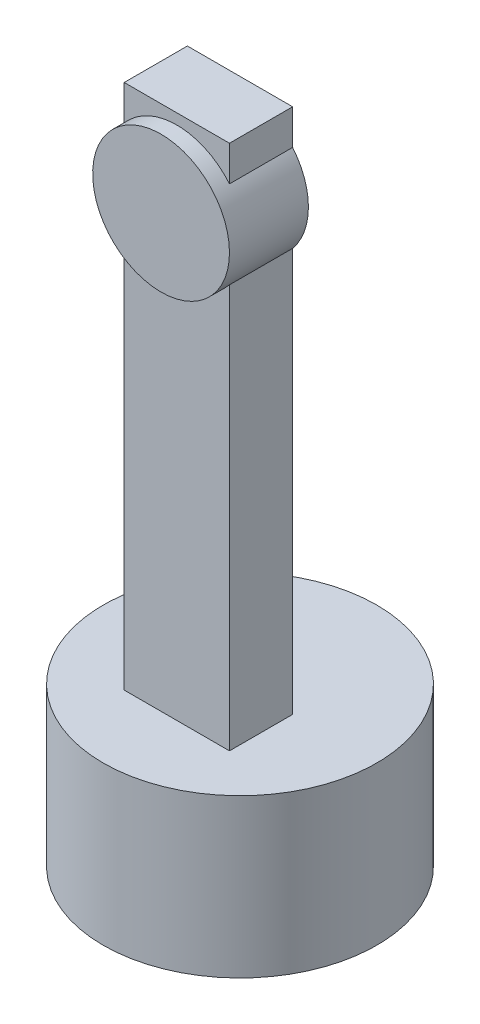
ISO-10303-21;
HEADER;
FILE_DESCRIPTION(('STEP AP214'),'2;1');
FILE_NAME('part.step','',(''),(''),'','','');
FILE_SCHEMA(('AUTOMOTIVE_DESIGN { 1 0 10303 214 1 1 1 1 }'));
ENDSEC;
DATA;
#1=APPLICATION_CONTEXT('core data for automotive mechanical design processes');
#2=APPLICATION_PROTOCOL_DEFINITION('international standard','automotive_design',2000,#1);
#3=PRODUCT_CONTEXT('',#1,'mechanical');
#4=PRODUCT('Part','Part','',(#3));
#5=PRODUCT_RELATED_PRODUCT_CATEGORY('part','',(#4));
#6=PRODUCT_DEFINITION_FORMATION('','',#4);
#7=PRODUCT_DEFINITION_CONTEXT('part definition',#1,'design');
#8=PRODUCT_DEFINITION('design','',#6,#7);
#9=PRODUCT_DEFINITION_SHAPE('','',#8);
#10=(LENGTH_UNIT() NAMED_UNIT(*) SI_UNIT(.MILLI.,.METRE.));
#11=(NAMED_UNIT(*) PLANE_ANGLE_UNIT() SI_UNIT($,.RADIAN.));
#12=(NAMED_UNIT(*) SI_UNIT($,.STERADIAN.) SOLID_ANGLE_UNIT());
#13=UNCERTAINTY_MEASURE_WITH_UNIT(LENGTH_MEASURE(1.E-05),#10,'distance_accuracy_value','');
#14=(GEOMETRIC_REPRESENTATION_CONTEXT(3) GLOBAL_UNCERTAINTY_ASSIGNED_CONTEXT((#13)) GLOBAL_UNIT_ASSIGNED_CONTEXT((#10,
#11,#12)) REPRESENTATION_CONTEXT('',''));
#15=CARTESIAN_POINT('',(0.,0.,0.));
#16=DIRECTION('',(0.,0.,1.));
#17=DIRECTION('',(1.,0.,0.));
#18=AXIS2_PLACEMENT_3D('',#15,#16,#17);
#19=CARTESIAN_POINT('',(-10000.,26000.,12000.));
#20=DIRECTION('',(1.,0.,0.));
#21=DIRECTION('',(0.,0.,-1.));
#22=AXIS2_PLACEMENT_3D('',#19,#20,#21);
#23=PLANE('',#22);
#24=DIRECTION('',(0.,0.,-1.));
#25=VECTOR('',#24,1.);
#26=CARTESIAN_POINT('',(-10000.,106693.376137082,15000.));
#27=LINE('',#26,#25);
#28=CARTESIAN_POINT('',(-10000.,106693.376137082,0.));
#29=VERTEX_POINT('',#28);
#30=CARTESIAN_POINT('',(-10000.,106693.376137082,12000.));
#31=VERTEX_POINT('',#30);
#32=EDGE_CURVE('E151',#29,#31,#27,.F.);
#33=ORIENTED_EDGE('',*,*,#32,.F.);
#34=DIRECTION('',(0.,-1.,0.));
#35=VECTOR('',#34,1.);
#36=CARTESIAN_POINT('',(-10000.,26000.,0.));
#37=LINE('',#36,#35);
#38=CARTESIAN_POINT('',(-10000.,30000.,0.));
#39=VERTEX_POINT('',#38);
#40=EDGE_CURVE('E154',#29,#39,#37,.T.);
#41=ORIENTED_EDGE('',*,*,#40,.T.);
#42=DIRECTION('',(0.,0.,-1.));
#43=VECTOR('',#42,1.);
#44=CARTESIAN_POINT('',(-10000.,30000.,0.));
#45=LINE('',#44,#43);
#46=CARTESIAN_POINT('',(-10000.,30000.,12000.));
#47=VERTEX_POINT('',#46);
#48=EDGE_CURVE('E53',#47,#39,#45,.T.);
#49=ORIENTED_EDGE('',*,*,#48,.F.);
#50=DIRECTION('',(0.,-1.,0.));
#51=VECTOR('',#50,1.);
#52=CARTESIAN_POINT('',(-10000.,26000.,12000.));
#53=LINE('',#52,#51);
#54=EDGE_CURVE('E116',#31,#47,#53,.T.);
#55=ORIENTED_EDGE('',*,*,#54,.F.);
#56=EDGE_LOOP('',(#33,#41,#49,#55));
#57=FACE_BOUND('',#56,.T.);
#58=ADVANCED_FACE('F44',(#57),#23,.F.);
#59=DIRECTION('',(0.,0.,-1.));
#60=VECTOR('',#59,1.);
#61=CARTESIAN_POINT('',(-10000.,123306.623862918,15000.));
#62=LINE('',#61,#60);
#63=CARTESIAN_POINT('',(-10000.,123306.623862918,12000.));
#64=VERTEX_POINT('',#63);
#65=CARTESIAN_POINT('',(-10000.,123306.623862918,0.));
#66=VERTEX_POINT('',#65);
#67=EDGE_CURVE('E122',#64,#66,#62,.T.);
#68=ORIENTED_EDGE('',*,*,#67,.F.);
#69=CARTESIAN_POINT('',(-10000.,130000.,12000.));
#70=VERTEX_POINT('',#69);
#71=EDGE_CURVE('E109',#70,#64,#53,.T.);
#72=ORIENTED_EDGE('',*,*,#71,.F.);
#73=DIRECTION('',(0.,0.,-1.));
#74=VECTOR('',#73,1.);
#75=CARTESIAN_POINT('',(-10000.,130000.,12000.));
#76=LINE('',#75,#74);
#77=CARTESIAN_POINT('',(-10000.,130000.,0.));
#78=VERTEX_POINT('',#77);
#79=EDGE_CURVE('E162',#70,#78,#76,.T.);
#80=ORIENTED_EDGE('',*,*,#79,.T.);
#81=EDGE_CURVE('E127',#78,#66,#37,.T.);
#82=ORIENTED_EDGE('',*,*,#81,.T.);
#83=EDGE_LOOP('',(#68,#72,#80,#82));
#84=FACE_BOUND('',#83,.T.);
#85=ADVANCED_FACE('F123',(#84),#23,.F.);
#86=CARTESIAN_POINT('',(10000.,26000.,12000.));
#87=DIRECTION('',(-1.,0.,0.));
#88=DIRECTION('',(0.,0.,1.));
#89=AXIS2_PLACEMENT_3D('',#86,#87,#88);
#90=PLANE('',#89);
#91=DIRECTION('',(0.,0.,-1.));
#92=VECTOR('',#91,1.);
#93=CARTESIAN_POINT('',(10000.,123306.623862918,15000.));
#94=LINE('',#93,#92);
#95=CARTESIAN_POINT('',(10000.,123306.623862918,0.));
#96=VERTEX_POINT('',#95);
#97=CARTESIAN_POINT('',(10000.,123306.623862918,12000.));
#98=VERTEX_POINT('',#97);
#99=EDGE_CURVE('E133',#96,#98,#94,.F.);
#100=ORIENTED_EDGE('',*,*,#99,.F.);
#101=DIRECTION('',(0.,1.,0.));
#102=VECTOR('',#101,1.);
#103=CARTESIAN_POINT('',(10000.,26000.,0.));
#104=LINE('',#103,#102);
#105=CARTESIAN_POINT('',(10000.,130000.,0.));
#106=VERTEX_POINT('',#105);
#107=EDGE_CURVE('E167',#96,#106,#104,.T.);
#108=ORIENTED_EDGE('',*,*,#107,.T.);
#109=DIRECTION('',(0.,0.,-1.));
#110=VECTOR('',#109,1.);
#111=CARTESIAN_POINT('',(10000.,130000.,12000.));
#112=LINE('',#111,#110);
#113=CARTESIAN_POINT('',(10000.,130000.,12000.));
#114=VERTEX_POINT('',#113);
#115=EDGE_CURVE('E171',#114,#106,#112,.T.);
#116=ORIENTED_EDGE('',*,*,#115,.F.);
#117=DIRECTION('',(0.,1.,0.));
#118=VECTOR('',#117,1.);
#119=CARTESIAN_POINT('',(10000.,26000.,12000.));
#120=LINE('',#119,#118);
#121=EDGE_CURVE('E120',#98,#114,#120,.T.);
#122=ORIENTED_EDGE('',*,*,#121,.F.);
#123=EDGE_LOOP('',(#100,#108,#116,#122));
#124=FACE_BOUND('',#123,.T.);
#125=ADVANCED_FACE('F225',(#124),#90,.F.);
#126=DIRECTION('',(0.,0.,-1.));
#127=VECTOR('',#126,1.);
#128=CARTESIAN_POINT('',(10000.,106693.376137082,15000.));
#129=LINE('',#128,#127);
#130=CARTESIAN_POINT('',(10000.,106693.376137082,12000.));
#131=VERTEX_POINT('',#130);
#132=CARTESIAN_POINT('',(10000.,106693.376137082,0.));
#133=VERTEX_POINT('',#132);
#134=EDGE_CURVE('E150',#131,#133,#129,.T.);
#135=ORIENTED_EDGE('',*,*,#134,.F.);
#136=CARTESIAN_POINT('',(10000.,30000.,12000.));
#137=VERTEX_POINT('',#136);
#138=EDGE_CURVE('E158',#137,#131,#120,.T.);
#139=ORIENTED_EDGE('',*,*,#138,.F.);
#140=DIRECTION('',(0.,0.,1.));
#141=VECTOR('',#140,1.);
#142=CARTESIAN_POINT('',(10000.,30000.,0.));
#143=LINE('',#142,#141);
#144=CARTESIAN_POINT('',(10000.,30000.,0.));
#145=VERTEX_POINT('',#144);
#146=EDGE_CURVE('E191',#145,#137,#143,.T.);
#147=ORIENTED_EDGE('',*,*,#146,.F.);
#148=EDGE_CURVE('E170',#145,#133,#104,.T.);
#149=ORIENTED_EDGE('',*,*,#148,.T.);
#150=EDGE_LOOP('',(#135,#139,#147,#149));
#151=FACE_BOUND('',#150,.T.);
#152=ADVANCED_FACE('F208',(#151),#90,.F.);
#153=CARTESIAN_POINT('',(0.,0.,12000.));
#154=DIRECTION('',(0.,0.,-1.));
#155=DIRECTION('',(-1.,0.,0.));
#156=AXIS2_PLACEMENT_3D('',#153,#154,#155);
#157=PLANE('',#156);
#158=CARTESIAN_POINT('',(0.,115000.,12000.));
#159=DIRECTION('',(0.,0.,-1.));
#160=DIRECTION('',(-1.,0.,0.));
#161=AXIS2_PLACEMENT_3D('',#158,#159,#160);
#162=CIRCLE('',#161,13000.);
#163=EDGE_CURVE('E63',#31,#131,#162,.F.);
#164=ORIENTED_EDGE('',*,*,#163,.F.);
#165=ORIENTED_EDGE('',*,*,#54,.T.);
#166=DIRECTION('',(-1.,0.,0.));
#167=VECTOR('',#166,1.);
#168=CARTESIAN_POINT('',(0.,30000.,12000.));
#169=LINE('',#168,#167);
#170=EDGE_CURVE('E11',#137,#47,#169,.T.);
#171=ORIENTED_EDGE('',*,*,#170,.F.);
#172=ORIENTED_EDGE('',*,*,#138,.T.);
#173=EDGE_LOOP('',(#164,#165,#171,#172));
#174=FACE_BOUND('',#173,.T.);
#175=ADVANCED_FACE('F209',(#174),#157,.F.);
#176=CARTESIAN_POINT('',(0.,30000.,0.));
#177=DIRECTION('',(0.,1.,0.));
#178=DIRECTION('',(0.,0.,1.));
#179=AXIS2_PLACEMENT_3D('',#176,#177,#178);
#180=PLANE('',#179);
#181=CARTESIAN_POINT('',(0.,30000.,0.));
#182=DIRECTION('',(0.,1.,0.));
#183=DIRECTION('',(0.,0.,1.));
#184=AXIS2_PLACEMENT_3D('',#181,#182,#183);
#185=CIRCLE('',#184,26000.);
#186=CARTESIAN_POINT('',(0.,30000.,26000.));
#187=VERTEX_POINT('',#186);
#188=EDGE_CURVE('E179',#187,#187,#185,.T.);
#189=ORIENTED_EDGE('',*,*,#188,.T.);
#190=EDGE_LOOP('',(#189));
#191=FACE_BOUND('',#190,.T.);
#192=ORIENTED_EDGE('',*,*,#146,.T.);
#193=ORIENTED_EDGE('',*,*,#170,.T.);
#194=ORIENTED_EDGE('',*,*,#48,.T.);
#195=DIRECTION('',(-1.,0.,0.));
#196=VECTOR('',#195,1.);
#197=CARTESIAN_POINT('',(0.,30000.,0.));
#198=LINE('',#197,#196);
#199=EDGE_CURVE('E184',#145,#39,#198,.T.);
#200=ORIENTED_EDGE('',*,*,#199,.F.);
#201=EDGE_LOOP('',(#192,#193,#194,#200));
#202=FACE_BOUND('',#201,.T.);
#203=ADVANCED_FACE('F197',(#191,#202),#180,.T.);
#204=CARTESIAN_POINT('',(0.,30000.,0.));
#205=DIRECTION('',(0.,-1.,0.));
#206=DIRECTION('',(0.,0.,-1.));
#207=AXIS2_PLACEMENT_3D('',#204,#205,#206);
#208=CYLINDRICAL_SURFACE('',#207,26000.);
#209=ORIENTED_EDGE('',*,*,#188,.F.);
#210=EDGE_LOOP('',(#209));
#211=FACE_BOUND('',#210,.T.);
#212=CARTESIAN_POINT('',(0.,0.,0.));
#213=DIRECTION('',(0.,1.,0.));
#214=DIRECTION('',(0.,0.,1.));
#215=AXIS2_PLACEMENT_3D('',#212,#213,#214);
#216=CIRCLE('',#215,26000.);
#217=CARTESIAN_POINT('',(0.,0.,26000.));
#218=VERTEX_POINT('',#217);
#219=EDGE_CURVE('E178',#218,#218,#216,.T.);
#220=ORIENTED_EDGE('',*,*,#219,.T.);
#221=EDGE_LOOP('',(#220));
#222=FACE_BOUND('',#221,.T.);
#223=ADVANCED_FACE('F50',(#211,#222),#208,.T.);
#224=CARTESIAN_POINT('',(0.,0.,0.));
#225=DIRECTION('',(0.,1.,0.));
#226=DIRECTION('',(0.,0.,1.));
#227=AXIS2_PLACEMENT_3D('',#224,#225,#226);
#228=PLANE('',#227);
#229=ORIENTED_EDGE('',*,*,#219,.F.);
#230=EDGE_LOOP('',(#229));
#231=FACE_BOUND('',#230,.T.);
#232=ADVANCED_FACE('F236',(#231),#228,.F.);
#233=CARTESIAN_POINT('',(-10000.,130000.,12000.));
#234=DIRECTION('',(0.,-1.,0.));
#235=DIRECTION('',(0.,0.,-1.));
#236=AXIS2_PLACEMENT_3D('',#233,#234,#235);
#237=PLANE('',#236);
#238=DIRECTION('',(-1.,0.,0.));
#239=VECTOR('',#238,1.);
#240=CARTESIAN_POINT('',(-10000.,130000.,0.));
#241=LINE('',#240,#239);
#242=EDGE_CURVE('E168',#106,#78,#241,.T.);
#243=ORIENTED_EDGE('',*,*,#242,.T.);
#244=ORIENTED_EDGE('',*,*,#79,.F.);
#245=DIRECTION('',(-1.,0.,0.));
#246=VECTOR('',#245,1.);
#247=CARTESIAN_POINT('',(-10000.,130000.,12000.));
#248=LINE('',#247,#246);
#249=EDGE_CURVE('E111',#114,#70,#248,.T.);
#250=ORIENTED_EDGE('',*,*,#249,.F.);
#251=ORIENTED_EDGE('',*,*,#115,.T.);
#252=EDGE_LOOP('',(#243,#244,#250,#251));
#253=FACE_BOUND('',#252,.T.);
#254=ADVANCED_FACE('F218',(#253),#237,.F.);
#255=EDGE_CURVE('E68',#98,#64,#162,.F.);
#256=ORIENTED_EDGE('',*,*,#255,.F.);
#257=ORIENTED_EDGE('',*,*,#121,.T.);
#258=ORIENTED_EDGE('',*,*,#249,.T.);
#259=ORIENTED_EDGE('',*,*,#71,.T.);
#260=EDGE_LOOP('',(#256,#257,#258,#259));
#261=FACE_BOUND('',#260,.T.);
#262=ADVANCED_FACE('F115',(#261),#157,.F.);
#263=CARTESIAN_POINT('',(0.,0.,0.));
#264=DIRECTION('',(0.,0.,-1.));
#265=DIRECTION('',(-1.,0.,0.));
#266=AXIS2_PLACEMENT_3D('',#263,#264,#265);
#267=PLANE('',#266);
#268=ORIENTED_EDGE('',*,*,#40,.F.);
#269=CARTESIAN_POINT('',(0.,115000.,0.));
#270=DIRECTION('',(0.,0.,1.));
#271=DIRECTION('',(1.,0.,0.));
#272=AXIS2_PLACEMENT_3D('',#269,#270,#271);
#273=CIRCLE('',#272,13000.);
#274=EDGE_CURVE('E141',#66,#29,#273,.T.);
#275=ORIENTED_EDGE('',*,*,#274,.F.);
#276=ORIENTED_EDGE('',*,*,#81,.F.);
#277=ORIENTED_EDGE('',*,*,#242,.F.);
#278=ORIENTED_EDGE('',*,*,#107,.F.);
#279=EDGE_CURVE('E206',#133,#96,#273,.T.);
#280=ORIENTED_EDGE('',*,*,#279,.F.);
#281=ORIENTED_EDGE('',*,*,#148,.F.);
#282=ORIENTED_EDGE('',*,*,#199,.T.);
#283=EDGE_LOOP('',(#268,#275,#276,#277,#278,#280,#281,#282));
#284=FACE_BOUND('',#283,.T.);
#285=ADVANCED_FACE('F204',(#284),#267,.T.);
#286=CARTESIAN_POINT('',(0.,115000.,15000.));
#287=DIRECTION('',(0.,0.,-1.));
#288=DIRECTION('',(-1.,0.,0.));
#289=AXIS2_PLACEMENT_3D('',#286,#287,#288);
#290=CYLINDRICAL_SURFACE('',#289,13000.);
#291=CARTESIAN_POINT('',(0.,115000.,15000.));
#292=DIRECTION('',(0.,0.,1.));
#293=DIRECTION('',(1.,0.,0.));
#294=AXIS2_PLACEMENT_3D('',#291,#292,#293);
#295=CIRCLE('',#294,13000.);
#296=CARTESIAN_POINT('',(13000.,115000.,15000.));
#297=VERTEX_POINT('',#296);
#298=EDGE_CURVE('E140',#297,#297,#295,.T.);
#299=ORIENTED_EDGE('',*,*,#298,.F.);
#300=EDGE_LOOP('',(#299));
#301=FACE_BOUND('',#300,.T.);
#302=ORIENTED_EDGE('',*,*,#274,.T.);
#303=ORIENTED_EDGE('',*,*,#32,.T.);
#304=ORIENTED_EDGE('',*,*,#163,.T.);
#305=ORIENTED_EDGE('',*,*,#134,.T.);
#306=ORIENTED_EDGE('',*,*,#279,.T.);
#307=ORIENTED_EDGE('',*,*,#99,.T.);
#308=ORIENTED_EDGE('',*,*,#255,.T.);
#309=ORIENTED_EDGE('',*,*,#67,.T.);
#310=EDGE_LOOP('',(#302,#303,#304,#305,#306,#307,#308,#309));
#311=FACE_BOUND('',#310,.T.);
#312=ADVANCED_FACE('F135',(#301,#311),#290,.T.);
#313=CARTESIAN_POINT('',(0.,115000.,15000.));
#314=DIRECTION('',(0.,0.,1.));
#315=DIRECTION('',(1.,0.,0.));
#316=AXIS2_PLACEMENT_3D('',#313,#314,#315);
#317=PLANE('',#316);
#318=ORIENTED_EDGE('',*,*,#298,.T.);
#319=EDGE_LOOP('',(#318));
#320=FACE_BOUND('',#319,.T.);
#321=ADVANCED_FACE('F316',(#320),#317,.T.);
#322=CLOSED_SHELL('',(#58,#85,#125,#152,#175,#203,#223,#232,#254,#262,#285,#312,#321));
#323=MANIFOLD_SOLID_BREP('B2',#322);
#324=ADVANCED_BREP_SHAPE_REPRESENTATION('',(#18,#323),#14);
#325=SHAPE_DEFINITION_REPRESENTATION(#9,#324);
ENDSEC;
END-ISO-10303-21;
